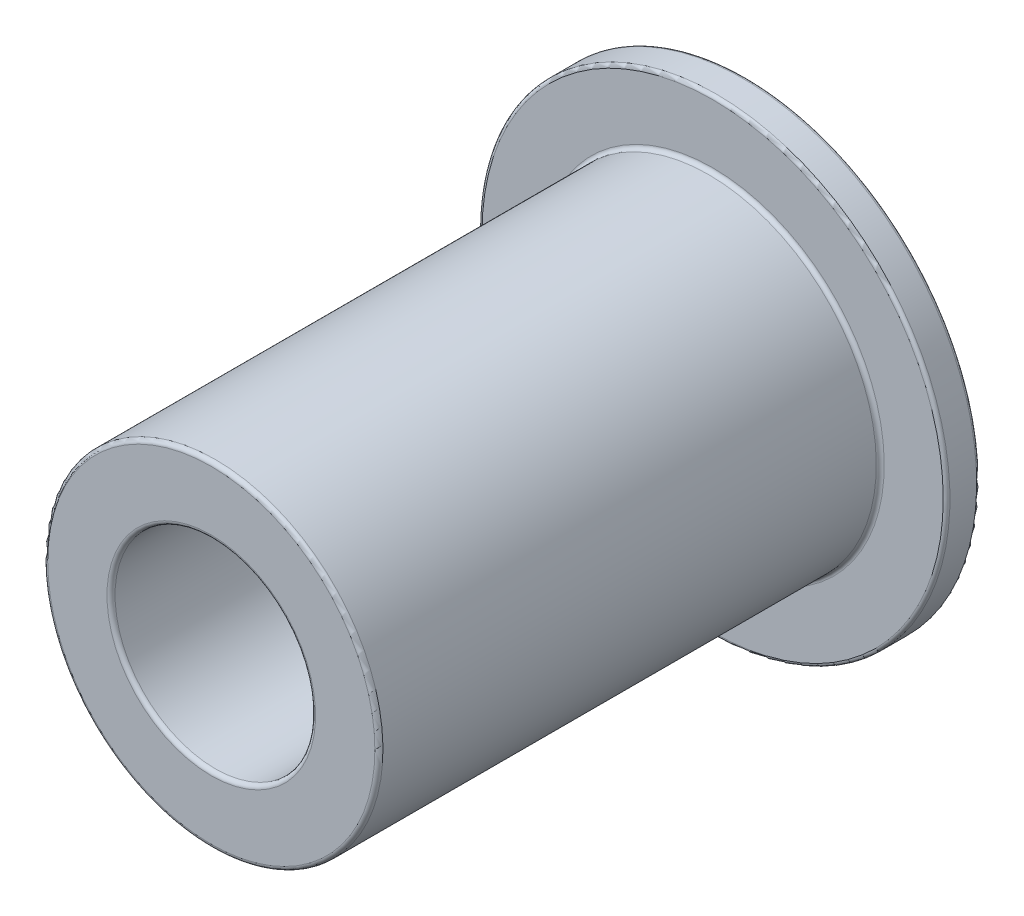
ISO-10303-21;
HEADER;
FILE_DESCRIPTION(('STEP AP214'),'2;1');
FILE_NAME('part.step','',(''),(''),'','','');
FILE_SCHEMA(('AUTOMOTIVE_DESIGN { 1 0 10303 214 1 1 1 1 }'));
ENDSEC;
DATA;
#1=APPLICATION_CONTEXT('core data for automotive mechanical design processes');
#2=APPLICATION_PROTOCOL_DEFINITION('international standard','automotive_design',2000,#1);
#3=PRODUCT_CONTEXT('',#1,'mechanical');
#4=PRODUCT('Part','Part','',(#3));
#5=PRODUCT_RELATED_PRODUCT_CATEGORY('part','',(#4));
#6=PRODUCT_DEFINITION_FORMATION('','',#4);
#7=PRODUCT_DEFINITION_CONTEXT('part definition',#1,'design');
#8=PRODUCT_DEFINITION('design','',#6,#7);
#9=PRODUCT_DEFINITION_SHAPE('','',#8);
#10=(LENGTH_UNIT() NAMED_UNIT(*) SI_UNIT(.MILLI.,.METRE.));
#11=(NAMED_UNIT(*) PLANE_ANGLE_UNIT() SI_UNIT($,.RADIAN.));
#12=(NAMED_UNIT(*) SI_UNIT($,.STERADIAN.) SOLID_ANGLE_UNIT());
#13=UNCERTAINTY_MEASURE_WITH_UNIT(LENGTH_MEASURE(1.E-05),#10,'distance_accuracy_value','');
#14=(GEOMETRIC_REPRESENTATION_CONTEXT(3) GLOBAL_UNCERTAINTY_ASSIGNED_CONTEXT((#13)) GLOBAL_UNIT_ASSIGNED_CONTEXT((#10,
#11,#12)) REPRESENTATION_CONTEXT('',''));
#15=CARTESIAN_POINT('',(0.,0.,0.));
#16=DIRECTION('',(0.,0.,1.));
#17=DIRECTION('',(1.,0.,0.));
#18=AXIS2_PLACEMENT_3D('',#15,#16,#17);
#19=CARTESIAN_POINT('',(0.,7.96289999999999,12.7));
#20=DIRECTION('',(0.,0.,-1.));
#21=DIRECTION('',(0.,1.,0.));
#22=AXIS2_PLACEMENT_3D('',#19,#20,#21);
#23=PLANE('',#22);
#24=CARTESIAN_POINT('',(0.,0.,12.7));
#25=DIRECTION('',(0.,0.,-1.));
#26=DIRECTION('',(0.,1.,0.));
#27=AXIS2_PLACEMENT_3D('',#24,#25,#26);
#28=CIRCLE('',#27,7.770876);
#29=CARTESIAN_POINT('',(0.,7.77087599999999,12.7));
#30=VERTEX_POINT('',#29);
#31=EDGE_CURVE('E52',#30,#30,#28,.F.);
#32=ORIENTED_EDGE('',*,*,#31,.T.);
#33=EDGE_LOOP('',(#32));
#34=FACE_BOUND('',#33,.T.);
#35=CARTESIAN_POINT('',(0.,0.,12.7));
#36=DIRECTION('',(0.,0.,-1.));
#37=DIRECTION('',(0.,1.,0.));
#38=AXIS2_PLACEMENT_3D('',#35,#36,#37);
#39=CIRCLE('',#38,4.954524);
#40=CARTESIAN_POINT('',(0.,4.95452399999999,12.7));
#41=VERTEX_POINT('',#40);
#42=EDGE_CURVE('E57',#41,#41,#39,.T.);
#43=ORIENTED_EDGE('',*,*,#42,.T.);
#44=EDGE_LOOP('',(#43));
#45=FACE_BOUND('',#44,.T.);
#46=ADVANCED_FACE('F37',(#34,#45),#23,.F.);
#47=CARTESIAN_POINT('',(0.,0.,12.7));
#48=DIRECTION('',(0.,0.,1.));
#49=DIRECTION('',(0.,-1.,0.));
#50=AXIS2_PLACEMENT_3D('',#47,#48,#49);
#51=CYLINDRICAL_SURFACE('',#50,4.7625);
#52=CARTESIAN_POINT('',(0.,0.,-12.507976));
#53=DIRECTION('',(0.,0.,1.));
#54=DIRECTION('',(0.,-1.,0.));
#55=AXIS2_PLACEMENT_3D('',#52,#53,#54);
#56=CIRCLE('',#55,4.7625);
#57=CARTESIAN_POINT('',(0.,-4.76249999999999,-12.507976));
#58=VERTEX_POINT('',#57);
#59=EDGE_CURVE('E60',#58,#58,#56,.F.);
#60=ORIENTED_EDGE('',*,*,#59,.T.);
#61=EDGE_LOOP('',(#60));
#62=FACE_BOUND('',#61,.T.);
#63=CARTESIAN_POINT('',(0.,0.,12.507976));
#64=DIRECTION('',(0.,0.,-1.));
#65=DIRECTION('',(0.,1.,0.));
#66=AXIS2_PLACEMENT_3D('',#63,#64,#65);
#67=CIRCLE('',#66,4.7625);
#68=CARTESIAN_POINT('',(0.,4.76249999999999,12.507976));
#69=VERTEX_POINT('',#68);
#70=EDGE_CURVE('E63',#69,#69,#67,.F.);
#71=ORIENTED_EDGE('',*,*,#70,.T.);
#72=EDGE_LOOP('',(#71));
#73=FACE_BOUND('',#72,.T.);
#74=ADVANCED_FACE('F106',(#62,#73),#51,.F.);
#75=CARTESIAN_POINT('',(0.,4.7625,-12.7));
#76=DIRECTION('',(0.,0.,1.));
#77=DIRECTION('',(0.,-1.,0.));
#78=AXIS2_PLACEMENT_3D('',#75,#76,#77);
#79=PLANE('',#78);
#80=CARTESIAN_POINT('',(0.,0.,-12.7));
#81=DIRECTION('',(0.,0.,1.));
#82=DIRECTION('',(0.,-1.,0.));
#83=AXIS2_PLACEMENT_3D('',#80,#81,#82);
#84=CIRCLE('',#83,4.954524);
#85=CARTESIAN_POINT('',(0.,-4.95452399999999,-12.7));
#86=VERTEX_POINT('',#85);
#87=EDGE_CURVE('E66',#86,#86,#84,.T.);
#88=ORIENTED_EDGE('',*,*,#87,.T.);
#89=EDGE_LOOP('',(#88));
#90=FACE_BOUND('',#89,.T.);
#91=CARTESIAN_POINT('',(0.,0.,-12.7));
#92=DIRECTION('',(0.,0.,1.));
#93=DIRECTION('',(0.,-1.,0.));
#94=AXIS2_PLACEMENT_3D('',#91,#92,#93);
#95=CIRCLE('',#94,10.95375);
#96=CARTESIAN_POINT('',(0.,-10.95375,-12.7));
#97=VERTEX_POINT('',#96);
#98=EDGE_CURVE('E72',#97,#97,#95,.F.);
#99=ORIENTED_EDGE('',*,*,#98,.T.);
#100=EDGE_LOOP('',(#99));
#101=FACE_BOUND('',#100,.T.);
#102=ADVANCED_FACE('F102',(#90,#101),#79,.F.);
#103=CARTESIAN_POINT('',(0.,0.,12.7));
#104=DIRECTION('',(0.,0.,1.));
#105=DIRECTION('',(0.,-1.,0.));
#106=AXIS2_PLACEMENT_3D('',#103,#104,#105);
#107=CYLINDRICAL_SURFACE('',#106,11.1125);
#108=CARTESIAN_POINT('',(0.,0.,-12.54125));
#109=DIRECTION('',(0.,0.,1.));
#110=DIRECTION('',(0.,-1.,0.));
#111=AXIS2_PLACEMENT_3D('',#108,#109,#110);
#112=CIRCLE('',#111,11.1125);
#113=CARTESIAN_POINT('',(0.,-11.1125,-12.54125));
#114=VERTEX_POINT('',#113);
#115=EDGE_CURVE('E75',#114,#114,#112,.T.);
#116=ORIENTED_EDGE('',*,*,#115,.T.);
#117=EDGE_LOOP('',(#116));
#118=FACE_BOUND('',#117,.T.);
#119=CARTESIAN_POINT('',(0.,0.,-11.27125));
#120=DIRECTION('',(0.,0.,-1.));
#121=DIRECTION('',(0.,1.,0.));
#122=AXIS2_PLACEMENT_3D('',#119,#120,#121);
#123=CIRCLE('',#122,11.1125);
#124=CARTESIAN_POINT('',(0.,11.1125,-11.27125));
#125=VERTEX_POINT('',#124);
#126=EDGE_CURVE('E78',#125,#125,#123,.T.);
#127=ORIENTED_EDGE('',*,*,#126,.T.);
#128=EDGE_LOOP('',(#127));
#129=FACE_BOUND('',#128,.T.);
#130=ADVANCED_FACE('F82',(#118,#129),#107,.T.);
#131=CARTESIAN_POINT('',(0.,11.1125,-11.1125));
#132=DIRECTION('',(0.,0.,-1.));
#133=DIRECTION('',(0.,1.,0.));
#134=AXIS2_PLACEMENT_3D('',#131,#132,#133);
#135=PLANE('',#134);
#136=CARTESIAN_POINT('',(0.,0.,-11.1125));
#137=DIRECTION('',(0.,0.,-1.));
#138=DIRECTION('',(0.,1.,0.));
#139=AXIS2_PLACEMENT_3D('',#136,#137,#138);
#140=CIRCLE('',#139,8.151876);
#141=CARTESIAN_POINT('',(0.,8.151876,-11.1125));
#142=VERTEX_POINT('',#141);
#143=EDGE_CURVE('E10',#142,#142,#140,.T.);
#144=ORIENTED_EDGE('',*,*,#143,.T.);
#145=EDGE_LOOP('',(#144));
#146=FACE_BOUND('',#145,.T.);
#147=CARTESIAN_POINT('',(0.,0.,-11.1125));
#148=DIRECTION('',(0.,0.,-1.));
#149=DIRECTION('',(0.,1.,0.));
#150=AXIS2_PLACEMENT_3D('',#147,#148,#149);
#151=CIRCLE('',#150,10.95375);
#152=CARTESIAN_POINT('',(0.,10.95375,-11.1125));
#153=VERTEX_POINT('',#152);
#154=EDGE_CURVE('E69',#153,#153,#151,.F.);
#155=ORIENTED_EDGE('',*,*,#154,.T.);
#156=EDGE_LOOP('',(#155));
#157=FACE_BOUND('',#156,.T.);
#158=ADVANCED_FACE('F92',(#146,#157),#135,.F.);
#159=CARTESIAN_POINT('',(0.,0.,12.7));
#160=DIRECTION('',(0.,0.,1.));
#161=DIRECTION('',(0.,-1.,0.));
#162=AXIS2_PLACEMENT_3D('',#159,#160,#161);
#163=CYLINDRICAL_SURFACE('',#162,7.96289999999999);
#164=CARTESIAN_POINT('',(0.,0.,-10.923524));
#165=DIRECTION('',(0.,0.,-1.));
#166=DIRECTION('',(0.,1.,0.));
#167=AXIS2_PLACEMENT_3D('',#164,#165,#166);
#168=CIRCLE('',#167,7.96289999999999);
#169=CARTESIAN_POINT('',(0.,7.9629,-10.923524));
#170=VERTEX_POINT('',#169);
#171=EDGE_CURVE('E44',#170,#170,#168,.F.);
#172=ORIENTED_EDGE('',*,*,#171,.T.);
#173=EDGE_LOOP('',(#172));
#174=FACE_BOUND('',#173,.T.);
#175=CARTESIAN_POINT('',(0.,0.,12.507976));
#176=DIRECTION('',(0.,0.,-1.));
#177=DIRECTION('',(0.,1.,0.));
#178=AXIS2_PLACEMENT_3D('',#175,#176,#177);
#179=CIRCLE('',#178,7.96289999999999);
#180=CARTESIAN_POINT('',(0.,7.96289999999999,12.507976));
#181=VERTEX_POINT('',#180);
#182=EDGE_CURVE('E48',#181,#181,#179,.T.);
#183=ORIENTED_EDGE('',*,*,#182,.T.);
#184=EDGE_LOOP('',(#183));
#185=FACE_BOUND('',#184,.T.);
#186=ADVANCED_FACE('F94',(#174,#185),#163,.T.);
#187=CARTESIAN_POINT('',(0.,0.,-12.54125));
#188=DIRECTION('',(0.,0.,1.));
#189=DIRECTION('',(0.,-1.,0.));
#190=AXIS2_PLACEMENT_3D('',#187,#188,#189);
#191=TOROIDAL_SURFACE('',#190,10.95375,0.15875);
#192=ORIENTED_EDGE('',*,*,#98,.F.);
#193=EDGE_LOOP('',(#192));
#194=FACE_BOUND('',#193,.T.);
#195=ORIENTED_EDGE('',*,*,#115,.F.);
#196=EDGE_LOOP('',(#195));
#197=FACE_BOUND('',#196,.T.);
#198=ADVANCED_FACE('F88',(#194,#197),#191,.T.);
#199=CARTESIAN_POINT('',(0.,0.,-11.27125));
#200=DIRECTION('',(0.,0.,-1.));
#201=DIRECTION('',(0.,1.,0.));
#202=AXIS2_PLACEMENT_3D('',#199,#200,#201);
#203=TOROIDAL_SURFACE('',#202,10.95375,0.15875);
#204=ORIENTED_EDGE('',*,*,#126,.F.);
#205=EDGE_LOOP('',(#204));
#206=FACE_BOUND('',#205,.T.);
#207=ORIENTED_EDGE('',*,*,#154,.F.);
#208=EDGE_LOOP('',(#207));
#209=FACE_BOUND('',#208,.T.);
#210=ADVANCED_FACE('F84',(#206,#209),#203,.T.);
#211=CARTESIAN_POINT('',(0.,0.,-12.507976));
#212=DIRECTION('',(0.,0.,1.));
#213=DIRECTION('',(0.,-1.,0.));
#214=AXIS2_PLACEMENT_3D('',#211,#212,#213);
#215=TOROIDAL_SURFACE('',#214,4.954524,0.192024);
#216=ORIENTED_EDGE('',*,*,#59,.F.);
#217=EDGE_LOOP('',(#216));
#218=FACE_BOUND('',#217,.T.);
#219=ORIENTED_EDGE('',*,*,#87,.F.);
#220=EDGE_LOOP('',(#219));
#221=FACE_BOUND('',#220,.T.);
#222=ADVANCED_FACE('F87',(#218,#221),#215,.T.);
#223=CARTESIAN_POINT('',(0.,0.,12.507976));
#224=DIRECTION('',(0.,0.,-1.));
#225=DIRECTION('',(0.,1.,0.));
#226=AXIS2_PLACEMENT_3D('',#223,#224,#225);
#227=TOROIDAL_SURFACE('',#226,7.770876,0.192024);
#228=ORIENTED_EDGE('',*,*,#182,.F.);
#229=EDGE_LOOP('',(#228));
#230=FACE_BOUND('',#229,.T.);
#231=ORIENTED_EDGE('',*,*,#31,.F.);
#232=EDGE_LOOP('',(#231));
#233=FACE_BOUND('',#232,.T.);
#234=ADVANCED_FACE('F122',(#230,#233),#227,.T.);
#235=CARTESIAN_POINT('',(0.,0.,12.507976));
#236=DIRECTION('',(0.,0.,-1.));
#237=DIRECTION('',(0.,1.,0.));
#238=AXIS2_PLACEMENT_3D('',#235,#236,#237);
#239=TOROIDAL_SURFACE('',#238,4.954524,0.192024);
#240=ORIENTED_EDGE('',*,*,#42,.F.);
#241=EDGE_LOOP('',(#240));
#242=FACE_BOUND('',#241,.T.);
#243=ORIENTED_EDGE('',*,*,#70,.F.);
#244=EDGE_LOOP('',(#243));
#245=FACE_BOUND('',#244,.T.);
#246=ADVANCED_FACE('F125',(#242,#245),#239,.T.);
#247=CARTESIAN_POINT('',(0.,0.,-10.923524));
#248=DIRECTION('',(0.,0.,-1.));
#249=DIRECTION('',(0.,1.,0.));
#250=AXIS2_PLACEMENT_3D('',#247,#248,#249);
#251=TOROIDAL_SURFACE('',#250,8.151876,0.188976);
#252=ORIENTED_EDGE('',*,*,#143,.F.);
#253=EDGE_LOOP('',(#252));
#254=FACE_BOUND('',#253,.T.);
#255=ORIENTED_EDGE('',*,*,#171,.F.);
#256=EDGE_LOOP('',(#255));
#257=FACE_BOUND('',#256,.T.);
#258=ADVANCED_FACE('F39',(#254,#257),#251,.F.);
#259=CLOSED_SHELL('',(#46,#74,#102,#130,#158,#186,#198,#210,#222,#234,#246,#258));
#260=MANIFOLD_SOLID_BREP('B2',#259);
#261=ADVANCED_BREP_SHAPE_REPRESENTATION('',(#18,#260),#14);
#262=SHAPE_DEFINITION_REPRESENTATION(#9,#261);
ENDSEC;
END-ISO-10303-21;
